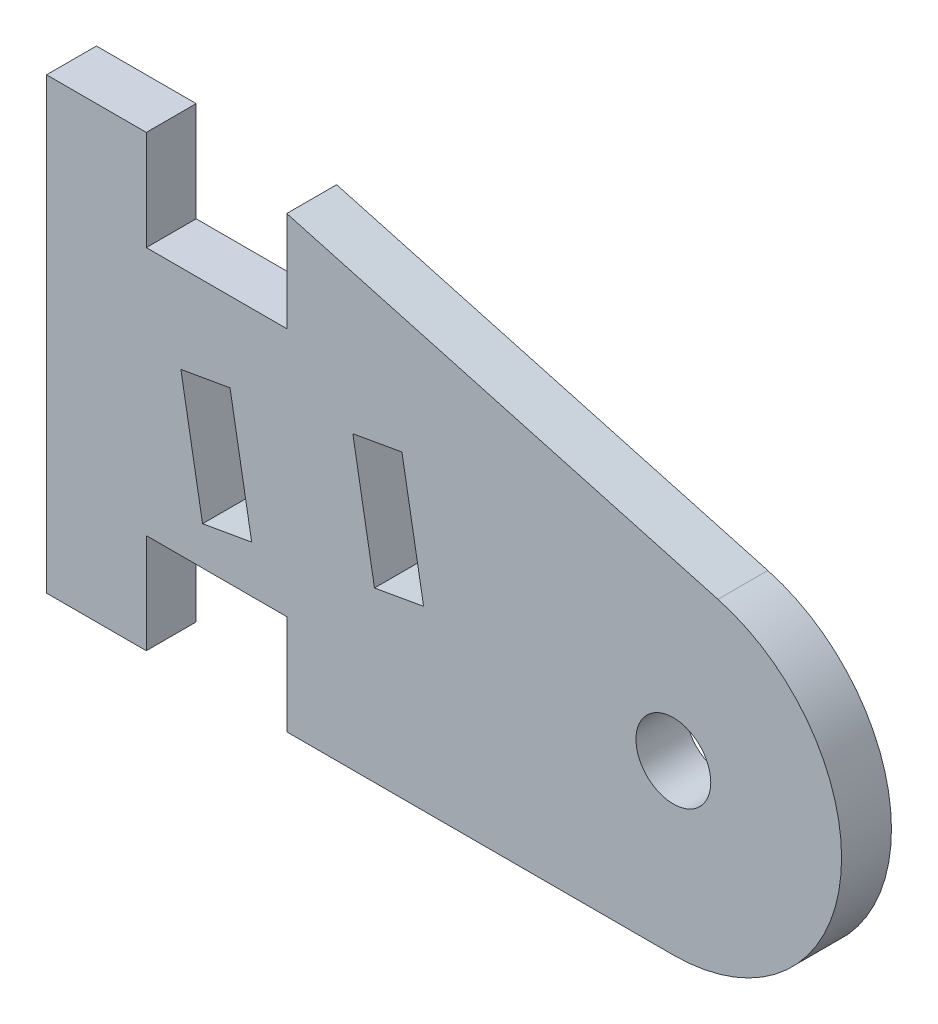
ISO-10303-21;
HEADER;
FILE_DESCRIPTION(('STEP AP214'),'2;1');
FILE_NAME('part.step','',(''),(''),'','','');
FILE_SCHEMA(('AUTOMOTIVE_DESIGN { 1 0 10303 214 1 1 1 1 }'));
ENDSEC;
DATA;
#1=APPLICATION_CONTEXT('core data for automotive mechanical design processes');
#2=APPLICATION_PROTOCOL_DEFINITION('international standard','automotive_design',2000,#1);
#3=PRODUCT_CONTEXT('',#1,'mechanical');
#4=PRODUCT('Part','Part','',(#3));
#5=PRODUCT_RELATED_PRODUCT_CATEGORY('part','',(#4));
#6=PRODUCT_DEFINITION_FORMATION('','',#4);
#7=PRODUCT_DEFINITION_CONTEXT('part definition',#1,'design');
#8=PRODUCT_DEFINITION('design','',#6,#7);
#9=PRODUCT_DEFINITION_SHAPE('','',#8);
#10=(LENGTH_UNIT() NAMED_UNIT(*) SI_UNIT(.MILLI.,.METRE.));
#11=(NAMED_UNIT(*) PLANE_ANGLE_UNIT() SI_UNIT($,.RADIAN.));
#12=(NAMED_UNIT(*) SI_UNIT($,.STERADIAN.) SOLID_ANGLE_UNIT());
#13=UNCERTAINTY_MEASURE_WITH_UNIT(LENGTH_MEASURE(1.E-05),#10,'distance_accuracy_value','');
#14=(GEOMETRIC_REPRESENTATION_CONTEXT(3) GLOBAL_UNCERTAINTY_ASSIGNED_CONTEXT((#13)) GLOBAL_UNIT_ASSIGNED_CONTEXT((#10,
#11,#12)) REPRESENTATION_CONTEXT('',''));
#15=CARTESIAN_POINT('',(0.,0.,0.));
#16=DIRECTION('',(0.,0.,1.));
#17=DIRECTION('',(1.,0.,0.));
#18=AXIS2_PLACEMENT_3D('',#15,#16,#17);
#19=CARTESIAN_POINT('',(25.1329602904938,6.74469141908519,2.));
#20=DIRECTION('',(0.,0.,1.));
#21=DIRECTION('',(1.,0.,0.));
#22=AXIS2_PLACEMENT_3D('',#19,#20,#21);
#23=PLANE('',#22);
#24=DIRECTION('',(-0.984807753012208,-0.173648177666932,0.));
#25=VECTOR('',#24,1.);
#26=CARTESIAN_POINT('',(14.2504500193325,12.02557168038,2.));
#27=LINE('',#26,#25);
#28=CARTESIAN_POINT('',(14.2504500193325,12.02557168038,2.));
#29=VERTEX_POINT('',#28);
#30=CARTESIAN_POINT('',(12.280834513308,11.6782753250461,2.));
#31=VERTEX_POINT('',#30);
#32=EDGE_CURVE('E177',#29,#31,#27,.T.);
#33=ORIENTED_EDGE('',*,*,#32,.F.);
#34=DIRECTION('',(-0.17364817766693,0.984807753012208,0.));
#35=VECTOR('',#34,1.);
#36=CARTESIAN_POINT('',(14.2504500193325,12.02557168038,2.));
#37=LINE('',#36,#35);
#38=CARTESIAN_POINT('',(15.1186909076671,7.10153291531893,2.));
#39=VERTEX_POINT('',#38);
#40=EDGE_CURVE('E169',#39,#29,#37,.T.);
#41=ORIENTED_EDGE('',*,*,#40,.F.);
#42=DIRECTION('',(0.984807753012208,0.173648177666931,0.));
#43=VECTOR('',#42,1.);
#44=CARTESIAN_POINT('',(13.1490754016427,6.75423655998507,2.));
#45=LINE('',#44,#43);
#46=CARTESIAN_POINT('',(13.1490754016427,6.75423655998507,2.));
#47=VERTEX_POINT('',#46);
#48=EDGE_CURVE('E192',#47,#39,#45,.T.);
#49=ORIENTED_EDGE('',*,*,#48,.F.);
#50=DIRECTION('',(0.173648177666931,-0.984807753012208,0.));
#51=VECTOR('',#50,1.);
#52=CARTESIAN_POINT('',(12.280834513308,11.6782753250461,2.));
#53=LINE('',#52,#51);
#54=EDGE_CURVE('E190',#31,#47,#53,.T.);
#55=ORIENTED_EDGE('',*,*,#54,.F.);
#56=EDGE_LOOP('',(#33,#41,#49,#55));
#57=FACE_BOUND('',#56,.T.);
#58=DIRECTION('',(0.,-1.,0.));
#59=VECTOR('',#58,1.);
#60=CARTESIAN_POINT('',(9.63151321176006,17.9999883596521,2.));
#61=LINE('',#60,#59);
#62=CARTESIAN_POINT('',(9.63151321176006,17.9999883596521,2.));
#63=VERTEX_POINT('',#62);
#64=CARTESIAN_POINT('',(9.63151321176006,13.9999883596521,2.));
#65=VERTEX_POINT('',#64);
#66=EDGE_CURVE('E239',#63,#65,#61,.T.);
#67=ORIENTED_EDGE('',*,*,#66,.T.);
#68=DIRECTION('',(-1.,0.,0.));
#69=VECTOR('',#68,1.);
#70=CARTESIAN_POINT('',(9.63151321176006,13.9999883596521,2.));
#71=LINE('',#70,#69);
#72=CARTESIAN_POINT('',(3.99999686234274,13.9999883596521,2.));
#73=VERTEX_POINT('',#72);
#74=EDGE_CURVE('E242',#65,#73,#71,.T.);
#75=ORIENTED_EDGE('',*,*,#74,.T.);
#76=DIRECTION('',(7.84410080292842E-07,0.999999999999692,0.));
#77=VECTOR('',#76,1.);
#78=CARTESIAN_POINT('',(3.99999999998306,17.9999883596509,2.));
#79=LINE('',#78,#77);
#80=CARTESIAN_POINT('',(3.99999999998306,17.9999883596509,2.));
#81=VERTEX_POINT('',#80);
#82=EDGE_CURVE('E245',#73,#81,#79,.T.);
#83=ORIENTED_EDGE('',*,*,#82,.T.);
#84=DIRECTION('',(-0.999999999995766,2.91008727185127E-06,0.));
#85=VECTOR('',#84,1.);
#86=CARTESIAN_POINT('',(0.,18.,2.));
#87=LINE('',#86,#85);
#88=CARTESIAN_POINT('',(0.,18.,2.));
#89=VERTEX_POINT('',#88);
#90=EDGE_CURVE('E247',#81,#89,#87,.T.);
#91=ORIENTED_EDGE('',*,*,#90,.T.);
#92=DIRECTION('',(0.,-1.,0.));
#93=VECTOR('',#92,1.);
#94=CARTESIAN_POINT('',(0.,0.,2.));
#95=LINE('',#94,#93);
#96=CARTESIAN_POINT('',(0.,0.,2.));
#97=VERTEX_POINT('',#96);
#98=EDGE_CURVE('E249',#89,#97,#95,.T.);
#99=ORIENTED_EDGE('',*,*,#98,.T.);
#100=DIRECTION('',(1.,0.,0.));
#101=VECTOR('',#100,1.);
#102=CARTESIAN_POINT('',(0.,0.,2.));
#103=LINE('',#102,#101);
#104=CARTESIAN_POINT('',(4.,0.,2.));
#105=VERTEX_POINT('',#104);
#106=EDGE_CURVE('E251',#97,#105,#103,.T.);
#107=ORIENTED_EDGE('',*,*,#106,.T.);
#108=DIRECTION('',(0.,1.,0.));
#109=VECTOR('',#108,1.);
#110=CARTESIAN_POINT('',(4.,0.,2.));
#111=LINE('',#110,#109);
#112=CARTESIAN_POINT('',(3.99999999999993,3.99964727608699,2.));
#113=VERTEX_POINT('',#112);
#114=EDGE_CURVE('E253',#105,#113,#111,.T.);
#115=ORIENTED_EDGE('',*,*,#114,.T.);
#116=DIRECTION('',(1.,0.,0.));
#117=VECTOR('',#116,1.);
#118=CARTESIAN_POINT('',(9.63146762713669,3.99964727608699,2.));
#119=LINE('',#118,#117);
#120=CARTESIAN_POINT('',(9.63146762713669,3.99964727608699,2.));
#121=VERTEX_POINT('',#120);
#122=EDGE_CURVE('E255',#113,#121,#119,.T.);
#123=ORIENTED_EDGE('',*,*,#122,.T.);
#124=DIRECTION('',(0.,-1.,0.));
#125=VECTOR('',#124,1.);
#126=CARTESIAN_POINT('',(9.63146762713669,-0.000352723912941215,2.));
#127=LINE('',#126,#125);
#128=CARTESIAN_POINT('',(9.63146762713669,-0.000352723912941215,2.));
#129=VERTEX_POINT('',#128);
#130=EDGE_CURVE('E257',#121,#129,#127,.T.);
#131=ORIENTED_EDGE('',*,*,#130,.T.);
#132=DIRECTION('',(1.,0.,0.));
#133=VECTOR('',#132,1.);
#134=CARTESIAN_POINT('',(9.63146762713669,-0.000352723912941215,2.));
#135=LINE('',#134,#133);
#136=CARTESIAN_POINT('',(25.1329602904938,-0.000352723912942082,2.));
#137=VERTEX_POINT('',#136);
#138=EDGE_CURVE('E259',#129,#137,#135,.T.);
#139=ORIENTED_EDGE('',*,*,#138,.T.);
#140=CARTESIAN_POINT('',(25.1329602904938,6.74469141908519,2.));
#141=DIRECTION('',(0.,0.,1.));
#142=DIRECTION('',(1.,0.,0.));
#143=AXIS2_PLACEMENT_3D('',#140,#141,#142);
#144=CIRCLE('',#143,6.74504414299814);
#145=CARTESIAN_POINT('',(26.9203877683975,13.2485920565664,2.));
#146=VERTEX_POINT('',#145);
#147=EDGE_CURVE('E261',#137,#146,#144,.T.);
#148=ORIENTED_EDGE('',*,*,#147,.T.);
#149=DIRECTION('',(-0.964248787642511,0.264998633071846,0.));
#150=VECTOR('',#149,1.);
#151=CARTESIAN_POINT('',(9.63151321176006,17.9999883596521,2.));
#152=LINE('',#151,#150);
#153=EDGE_CURVE('E263',#146,#63,#152,.T.);
#154=ORIENTED_EDGE('',*,*,#153,.T.);
#155=EDGE_LOOP('',(#67,#75,#83,#91,#99,#107,#115,#123,#131,#139,#148,#154));
#156=FACE_BOUND('',#155,.T.);
#157=DIRECTION('',(0.173648177666931,-0.984807753012208,0.));
#158=VECTOR('',#157,1.);
#159=CARTESIAN_POINT('',(5.38718024222247,10.4627380813776,2.));
#160=LINE('',#159,#158);
#161=CARTESIAN_POINT('',(5.38718024222247,10.4627380813776,2.));
#162=VERTEX_POINT('',#161);
#163=CARTESIAN_POINT('',(6.25542113055713,5.53869931631654,2.));
#164=VERTEX_POINT('',#163);
#165=EDGE_CURVE('E210',#162,#164,#160,.T.);
#166=ORIENTED_EDGE('',*,*,#165,.F.);
#167=DIRECTION('',(-0.984807753012208,-0.17364817766693,0.));
#168=VECTOR('',#167,1.);
#169=CARTESIAN_POINT('',(7.35679574824689,10.8100344367115,2.));
#170=LINE('',#169,#168);
#171=CARTESIAN_POINT('',(7.35679574824689,10.8100344367115,2.));
#172=VERTEX_POINT('',#171);
#173=EDGE_CURVE('E208',#172,#162,#170,.T.);
#174=ORIENTED_EDGE('',*,*,#173,.F.);
#175=DIRECTION('',(-0.17364817766693,0.984807753012208,0.));
#176=VECTOR('',#175,1.);
#177=CARTESIAN_POINT('',(7.35679574824689,10.8100344367115,2.));
#178=LINE('',#177,#176);
#179=CARTESIAN_POINT('',(8.22503663658155,5.8859956716504,2.));
#180=VERTEX_POINT('',#179);
#181=EDGE_CURVE('E216',#180,#172,#178,.T.);
#182=ORIENTED_EDGE('',*,*,#181,.F.);
#183=DIRECTION('',(0.984807753012208,0.173648177666929,0.));
#184=VECTOR('',#183,1.);
#185=CARTESIAN_POINT('',(6.25542113055713,5.53869931631654,2.));
#186=LINE('',#185,#184);
#187=EDGE_CURVE('E213',#164,#180,#186,.T.);
#188=ORIENTED_EDGE('',*,*,#187,.F.);
#189=EDGE_LOOP('',(#166,#174,#182,#188));
#190=FACE_BOUND('',#189,.T.);
#191=CARTESIAN_POINT('',(25.1329602904938,6.74469141908519,2.));
#192=DIRECTION('',(0.,0.,1.));
#193=DIRECTION('',(1.,0.,0.));
#194=AXIS2_PLACEMENT_3D('',#191,#192,#193);
#195=CIRCLE('',#194,1.49999999999872);
#196=CARTESIAN_POINT('',(26.6329602904925,6.74469141908519,2.));
#197=VERTEX_POINT('',#196);
#198=EDGE_CURVE('E198',#197,#197,#195,.T.);
#199=ORIENTED_EDGE('',*,*,#198,.F.);
#200=EDGE_LOOP('',(#199));
#201=FACE_BOUND('',#200,.T.);
#202=ADVANCED_FACE('F32',(#57,#156,#190,#201),#23,.T.);
#203=CARTESIAN_POINT('',(25.1329602904938,6.74469141908519,0.));
#204=DIRECTION('',(0.,0.,1.));
#205=DIRECTION('',(1.,0.,0.));
#206=AXIS2_PLACEMENT_3D('',#203,#204,#205);
#207=PLANE('',#206);
#208=DIRECTION('',(-0.17364817766693,0.984807753012208,0.));
#209=VECTOR('',#208,1.);
#210=CARTESIAN_POINT('',(14.2504500193325,12.02557168038,0.));
#211=LINE('',#210,#209);
#212=CARTESIAN_POINT('',(15.1186909076671,7.10153291531893,0.));
#213=VERTEX_POINT('',#212);
#214=CARTESIAN_POINT('',(14.2504500193325,12.02557168038,0.));
#215=VERTEX_POINT('',#214);
#216=EDGE_CURVE('E55',#213,#215,#211,.T.);
#217=ORIENTED_EDGE('',*,*,#216,.T.);
#218=DIRECTION('',(-0.984807753012208,-0.173648177666932,0.));
#219=VECTOR('',#218,1.);
#220=CARTESIAN_POINT('',(14.2504500193325,12.02557168038,0.));
#221=LINE('',#220,#219);
#222=CARTESIAN_POINT('',(12.280834513308,11.6782753250461,0.));
#223=VERTEX_POINT('',#222);
#224=EDGE_CURVE('E184',#215,#223,#221,.T.);
#225=ORIENTED_EDGE('',*,*,#224,.T.);
#226=DIRECTION('',(0.173648177666931,-0.984807753012208,0.));
#227=VECTOR('',#226,1.);
#228=CARTESIAN_POINT('',(12.280834513308,11.6782753250461,0.));
#229=LINE('',#228,#227);
#230=CARTESIAN_POINT('',(13.1490754016427,6.75423655998507,0.));
#231=VERTEX_POINT('',#230);
#232=EDGE_CURVE('E200',#223,#231,#229,.T.);
#233=ORIENTED_EDGE('',*,*,#232,.T.);
#234=DIRECTION('',(0.984807753012208,0.173648177666931,0.));
#235=VECTOR('',#234,1.);
#236=CARTESIAN_POINT('',(13.1490754016427,6.75423655998507,0.));
#237=LINE('',#236,#235);
#238=EDGE_CURVE('E178',#231,#213,#237,.T.);
#239=ORIENTED_EDGE('',*,*,#238,.T.);
#240=EDGE_LOOP('',(#217,#225,#233,#239));
#241=FACE_BOUND('',#240,.T.);
#242=DIRECTION('',(0.,-1.,0.));
#243=VECTOR('',#242,1.);
#244=CARTESIAN_POINT('',(9.63151321176006,17.9999883596521,0.));
#245=LINE('',#244,#243);
#246=CARTESIAN_POINT('',(9.63151321176006,17.9999883596521,0.));
#247=VERTEX_POINT('',#246);
#248=CARTESIAN_POINT('',(9.63151321176006,13.9999883596521,0.));
#249=VERTEX_POINT('',#248);
#250=EDGE_CURVE('E238',#247,#249,#245,.T.);
#251=ORIENTED_EDGE('',*,*,#250,.F.);
#252=DIRECTION('',(-0.964248787642511,0.264998633071846,0.));
#253=VECTOR('',#252,1.);
#254=CARTESIAN_POINT('',(9.63151321176006,17.9999883596521,0.));
#255=LINE('',#254,#253);
#256=CARTESIAN_POINT('',(26.9203877683975,13.2485920565664,0.));
#257=VERTEX_POINT('',#256);
#258=EDGE_CURVE('E243',#257,#247,#255,.T.);
#259=ORIENTED_EDGE('',*,*,#258,.F.);
#260=CARTESIAN_POINT('',(25.1329602904938,6.74469141908519,0.));
#261=DIRECTION('',(0.,0.,1.));
#262=DIRECTION('',(1.,0.,0.));
#263=AXIS2_PLACEMENT_3D('',#260,#261,#262);
#264=CIRCLE('',#263,6.74504414299814);
#265=CARTESIAN_POINT('',(25.1329602904938,-0.000352723912942082,0.));
#266=VERTEX_POINT('',#265);
#267=EDGE_CURVE('E286',#266,#257,#264,.T.);
#268=ORIENTED_EDGE('',*,*,#267,.F.);
#269=DIRECTION('',(1.,0.,0.));
#270=VECTOR('',#269,1.);
#271=CARTESIAN_POINT('',(9.63146762713669,-0.000352723912941215,0.));
#272=LINE('',#271,#270);
#273=CARTESIAN_POINT('',(9.63146762713669,-0.000352723912941215,0.));
#274=VERTEX_POINT('',#273);
#275=EDGE_CURVE('E284',#274,#266,#272,.T.);
#276=ORIENTED_EDGE('',*,*,#275,.F.);
#277=DIRECTION('',(0.,-1.,0.));
#278=VECTOR('',#277,1.);
#279=CARTESIAN_POINT('',(9.63146762713669,-0.000352723912941215,0.));
#280=LINE('',#279,#278);
#281=CARTESIAN_POINT('',(9.63146762713669,3.99964727608699,0.));
#282=VERTEX_POINT('',#281);
#283=EDGE_CURVE('E282',#282,#274,#280,.T.);
#284=ORIENTED_EDGE('',*,*,#283,.F.);
#285=DIRECTION('',(1.,0.,0.));
#286=VECTOR('',#285,1.);
#287=CARTESIAN_POINT('',(9.63146762713669,3.99964727608699,0.));
#288=LINE('',#287,#286);
#289=CARTESIAN_POINT('',(3.99999999999993,3.99964727608699,0.));
#290=VERTEX_POINT('',#289);
#291=EDGE_CURVE('E280',#290,#282,#288,.T.);
#292=ORIENTED_EDGE('',*,*,#291,.F.);
#293=DIRECTION('',(0.,1.,0.));
#294=VECTOR('',#293,1.);
#295=CARTESIAN_POINT('',(4.,0.,0.));
#296=LINE('',#295,#294);
#297=CARTESIAN_POINT('',(4.,0.,0.));
#298=VERTEX_POINT('',#297);
#299=EDGE_CURVE('E278',#298,#290,#296,.T.);
#300=ORIENTED_EDGE('',*,*,#299,.F.);
#301=DIRECTION('',(1.,0.,0.));
#302=VECTOR('',#301,1.);
#303=CARTESIAN_POINT('',(0.,0.,0.));
#304=LINE('',#303,#302);
#305=CARTESIAN_POINT('',(0.,0.,0.));
#306=VERTEX_POINT('',#305);
#307=EDGE_CURVE('E276',#306,#298,#304,.T.);
#308=ORIENTED_EDGE('',*,*,#307,.F.);
#309=DIRECTION('',(0.,-1.,0.));
#310=VECTOR('',#309,1.);
#311=CARTESIAN_POINT('',(0.,0.,0.));
#312=LINE('',#311,#310);
#313=CARTESIAN_POINT('',(0.,18.,0.));
#314=VERTEX_POINT('',#313);
#315=EDGE_CURVE('E274',#314,#306,#312,.T.);
#316=ORIENTED_EDGE('',*,*,#315,.F.);
#317=DIRECTION('',(-0.999999999995766,2.91008727185127E-06,0.));
#318=VECTOR('',#317,1.);
#319=CARTESIAN_POINT('',(0.,18.,0.));
#320=LINE('',#319,#318);
#321=CARTESIAN_POINT('',(3.99999999998306,17.9999883596509,0.));
#322=VERTEX_POINT('',#321);
#323=EDGE_CURVE('E272',#322,#314,#320,.T.);
#324=ORIENTED_EDGE('',*,*,#323,.F.);
#325=DIRECTION('',(7.84410080292842E-07,0.999999999999692,0.));
#326=VECTOR('',#325,1.);
#327=CARTESIAN_POINT('',(3.99999999998306,17.9999883596509,0.));
#328=LINE('',#327,#326);
#329=CARTESIAN_POINT('',(3.99999686234274,13.9999883596521,0.));
#330=VERTEX_POINT('',#329);
#331=EDGE_CURVE('E270',#330,#322,#328,.T.);
#332=ORIENTED_EDGE('',*,*,#331,.F.);
#333=DIRECTION('',(-1.,0.,0.));
#334=VECTOR('',#333,1.);
#335=CARTESIAN_POINT('',(9.63151321176006,13.9999883596521,0.));
#336=LINE('',#335,#334);
#337=EDGE_CURVE('E268',#249,#330,#336,.T.);
#338=ORIENTED_EDGE('',*,*,#337,.F.);
#339=EDGE_LOOP('',(#251,#259,#268,#276,#284,#292,#300,#308,#316,#324,#332,#338));
#340=FACE_BOUND('',#339,.T.);
#341=DIRECTION('',(-0.984807753012208,-0.17364817766693,0.));
#342=VECTOR('',#341,1.);
#343=CARTESIAN_POINT('',(7.35679574824689,10.8100344367115,0.));
#344=LINE('',#343,#342);
#345=CARTESIAN_POINT('',(7.3567957482469,10.8100344367115,0.));
#346=VERTEX_POINT('',#345);
#347=CARTESIAN_POINT('',(5.38718024222247,10.4627380813776,0.));
#348=VERTEX_POINT('',#347);
#349=EDGE_CURVE('E185',#346,#348,#344,.T.);
#350=ORIENTED_EDGE('',*,*,#349,.T.);
#351=DIRECTION('',(0.173648177666931,-0.984807753012208,0.));
#352=VECTOR('',#351,1.);
#353=CARTESIAN_POINT('',(5.38718024222247,10.4627380813776,0.));
#354=LINE('',#353,#352);
#355=CARTESIAN_POINT('',(6.25542113055713,5.53869931631654,0.));
#356=VERTEX_POINT('',#355);
#357=EDGE_CURVE('E221',#348,#356,#354,.T.);
#358=ORIENTED_EDGE('',*,*,#357,.T.);
#359=DIRECTION('',(0.984807753012208,0.173648177666929,0.));
#360=VECTOR('',#359,1.);
#361=CARTESIAN_POINT('',(6.25542113055713,5.53869931631654,0.));
#362=LINE('',#361,#360);
#363=CARTESIAN_POINT('',(8.22503663658155,5.8859956716504,0.));
#364=VERTEX_POINT('',#363);
#365=EDGE_CURVE('E224',#356,#364,#362,.T.);
#366=ORIENTED_EDGE('',*,*,#365,.T.);
#367=DIRECTION('',(-0.17364817766693,0.984807753012208,0.));
#368=VECTOR('',#367,1.);
#369=CARTESIAN_POINT('',(7.35679574824689,10.8100344367115,0.));
#370=LINE('',#369,#368);
#371=EDGE_CURVE('E211',#364,#346,#370,.T.);
#372=ORIENTED_EDGE('',*,*,#371,.T.);
#373=EDGE_LOOP('',(#350,#358,#366,#372));
#374=FACE_BOUND('',#373,.T.);
#375=CARTESIAN_POINT('',(25.1329602904938,6.74469141908519,0.));
#376=DIRECTION('',(0.,0.,1.));
#377=DIRECTION('',(1.,0.,0.));
#378=AXIS2_PLACEMENT_3D('',#375,#376,#377);
#379=CIRCLE('',#378,1.49999999999872);
#380=CARTESIAN_POINT('',(26.6329602904925,6.74469141908519,0.));
#381=VERTEX_POINT('',#380);
#382=EDGE_CURVE('E580',#381,#381,#379,.T.);
#383=ORIENTED_EDGE('',*,*,#382,.T.);
#384=EDGE_LOOP('',(#383));
#385=FACE_BOUND('',#384,.T.);
#386=ADVANCED_FACE('F328',(#241,#340,#374,#385),#207,.F.);
#387=CARTESIAN_POINT('',(9.63151321176006,17.9999883596521,2.));
#388=DIRECTION('',(1.,0.,0.));
#389=DIRECTION('',(0.,1.,0.));
#390=AXIS2_PLACEMENT_3D('',#387,#388,#389);
#391=PLANE('',#390);
#392=ORIENTED_EDGE('',*,*,#250,.T.);
#393=DIRECTION('',(0.,0.,-1.));
#394=VECTOR('',#393,1.);
#395=CARTESIAN_POINT('',(9.63151321176006,13.9999883596521,2.));
#396=LINE('',#395,#394);
#397=EDGE_CURVE('E11',#65,#249,#396,.T.);
#398=ORIENTED_EDGE('',*,*,#397,.F.);
#399=ORIENTED_EDGE('',*,*,#66,.F.);
#400=DIRECTION('',(0.,0.,-1.));
#401=VECTOR('',#400,1.);
#402=CARTESIAN_POINT('',(9.63151321176006,17.9999883596521,2.));
#403=LINE('',#402,#401);
#404=EDGE_CURVE('E265',#63,#247,#403,.T.);
#405=ORIENTED_EDGE('',*,*,#404,.T.);
#406=EDGE_LOOP('',(#392,#398,#399,#405));
#407=FACE_BOUND('',#406,.T.);
#408=ADVANCED_FACE('F34',(#407),#391,.F.);
#409=CARTESIAN_POINT('',(9.63151321176006,13.9999883596521,2.));
#410=DIRECTION('',(0.,-1.,0.));
#411=DIRECTION('',(0.,0.,-1.));
#412=AXIS2_PLACEMENT_3D('',#409,#410,#411);
#413=PLANE('',#412);
#414=ORIENTED_EDGE('',*,*,#337,.T.);
#415=DIRECTION('',(0.,0.,-1.));
#416=VECTOR('',#415,1.);
#417=CARTESIAN_POINT('',(3.99999686234274,13.9999883596521,2.));
#418=LINE('',#417,#416);
#419=EDGE_CURVE('E40',#73,#330,#418,.T.);
#420=ORIENTED_EDGE('',*,*,#419,.F.);
#421=ORIENTED_EDGE('',*,*,#74,.F.);
#422=ORIENTED_EDGE('',*,*,#397,.T.);
#423=EDGE_LOOP('',(#414,#420,#421,#422));
#424=FACE_BOUND('',#423,.T.);
#425=ADVANCED_FACE('F345',(#424),#413,.F.);
#426=CARTESIAN_POINT('',(3.99999999998306,17.9999883596509,2.));
#427=DIRECTION('',(-0.999999999999692,7.84410080292842E-07,0.));
#428=DIRECTION('',(-7.84410080292842E-07,-0.999999999999692,0.));
#429=AXIS2_PLACEMENT_3D('',#426,#427,#428);
#430=PLANE('',#429);
#431=ORIENTED_EDGE('',*,*,#331,.T.);
#432=DIRECTION('',(0.,0.,-1.));
#433=VECTOR('',#432,1.);
#434=CARTESIAN_POINT('',(3.99999999998306,17.9999883596509,2.));
#435=LINE('',#434,#433);
#436=EDGE_CURVE('E315',#81,#322,#435,.T.);
#437=ORIENTED_EDGE('',*,*,#436,.F.);
#438=ORIENTED_EDGE('',*,*,#82,.F.);
#439=ORIENTED_EDGE('',*,*,#419,.T.);
#440=EDGE_LOOP('',(#431,#437,#438,#439));
#441=FACE_BOUND('',#440,.T.);
#442=ADVANCED_FACE('F322',(#441),#430,.F.);
#443=CARTESIAN_POINT('',(0.,18.,2.));
#444=DIRECTION('',(-2.91008727185127E-06,-0.999999999995766,0.));
#445=DIRECTION('',(0.999999999995766,-2.91008727185127E-06,0.));
#446=AXIS2_PLACEMENT_3D('',#443,#444,#445);
#447=PLANE('',#446);
#448=ORIENTED_EDGE('',*,*,#323,.T.);
#449=DIRECTION('',(0.,0.,-1.));
#450=VECTOR('',#449,1.);
#451=CARTESIAN_POINT('',(0.,18.,2.));
#452=LINE('',#451,#450);
#453=EDGE_CURVE('E312',#89,#314,#452,.T.);
#454=ORIENTED_EDGE('',*,*,#453,.F.);
#455=ORIENTED_EDGE('',*,*,#90,.F.);
#456=ORIENTED_EDGE('',*,*,#436,.T.);
#457=EDGE_LOOP('',(#448,#454,#455,#456));
#458=FACE_BOUND('',#457,.T.);
#459=ADVANCED_FACE('F334',(#458),#447,.F.);
#460=CARTESIAN_POINT('',(0.,0.,2.));
#461=DIRECTION('',(1.,0.,0.));
#462=DIRECTION('',(0.,0.,-1.));
#463=AXIS2_PLACEMENT_3D('',#460,#461,#462);
#464=PLANE('',#463);
#465=ORIENTED_EDGE('',*,*,#315,.T.);
#466=DIRECTION('',(0.,0.,-1.));
#467=VECTOR('',#466,1.);
#468=CARTESIAN_POINT('',(0.,0.,2.));
#469=LINE('',#468,#467);
#470=EDGE_CURVE('E309',#97,#306,#469,.T.);
#471=ORIENTED_EDGE('',*,*,#470,.F.);
#472=ORIENTED_EDGE('',*,*,#98,.F.);
#473=ORIENTED_EDGE('',*,*,#453,.T.);
#474=EDGE_LOOP('',(#465,#471,#472,#473));
#475=FACE_BOUND('',#474,.T.);
#476=ADVANCED_FACE('F338',(#475),#464,.F.);
#477=CARTESIAN_POINT('',(0.,0.,2.));
#478=DIRECTION('',(0.,1.,0.));
#479=DIRECTION('',(0.,0.,1.));
#480=AXIS2_PLACEMENT_3D('',#477,#478,#479);
#481=PLANE('',#480);
#482=ORIENTED_EDGE('',*,*,#307,.T.);
#483=DIRECTION('',(0.,0.,-1.));
#484=VECTOR('',#483,1.);
#485=CARTESIAN_POINT('',(4.,0.,2.));
#486=LINE('',#485,#484);
#487=EDGE_CURVE('E306',#105,#298,#486,.T.);
#488=ORIENTED_EDGE('',*,*,#487,.F.);
#489=ORIENTED_EDGE('',*,*,#106,.F.);
#490=ORIENTED_EDGE('',*,*,#470,.T.);
#491=EDGE_LOOP('',(#482,#488,#489,#490));
#492=FACE_BOUND('',#491,.T.);
#493=ADVANCED_FACE('F378',(#492),#481,.F.);
#494=CARTESIAN_POINT('',(4.,0.,2.));
#495=DIRECTION('',(-1.,0.,0.));
#496=DIRECTION('',(0.,-1.,0.));
#497=AXIS2_PLACEMENT_3D('',#494,#495,#496);
#498=PLANE('',#497);
#499=ORIENTED_EDGE('',*,*,#299,.T.);
#500=DIRECTION('',(0.,0.,-1.));
#501=VECTOR('',#500,1.);
#502=CARTESIAN_POINT('',(3.99999999999993,3.99964727608699,2.));
#503=LINE('',#502,#501);
#504=EDGE_CURVE('E303',#113,#290,#503,.T.);
#505=ORIENTED_EDGE('',*,*,#504,.F.);
#506=ORIENTED_EDGE('',*,*,#114,.F.);
#507=ORIENTED_EDGE('',*,*,#487,.T.);
#508=EDGE_LOOP('',(#499,#505,#506,#507));
#509=FACE_BOUND('',#508,.T.);
#510=ADVANCED_FACE('F376',(#509),#498,.F.);
#511=CARTESIAN_POINT('',(9.63146762713669,3.99964727608699,2.));
#512=DIRECTION('',(0.,1.,0.));
#513=DIRECTION('',(0.,0.,1.));
#514=AXIS2_PLACEMENT_3D('',#511,#512,#513);
#515=PLANE('',#514);
#516=ORIENTED_EDGE('',*,*,#291,.T.);
#517=DIRECTION('',(0.,0.,-1.));
#518=VECTOR('',#517,1.);
#519=CARTESIAN_POINT('',(9.63146762713669,3.99964727608699,2.));
#520=LINE('',#519,#518);
#521=EDGE_CURVE('E300',#121,#282,#520,.T.);
#522=ORIENTED_EDGE('',*,*,#521,.F.);
#523=ORIENTED_EDGE('',*,*,#122,.F.);
#524=ORIENTED_EDGE('',*,*,#504,.T.);
#525=EDGE_LOOP('',(#516,#522,#523,#524));
#526=FACE_BOUND('',#525,.T.);
#527=ADVANCED_FACE('F372',(#526),#515,.F.);
#528=CARTESIAN_POINT('',(9.63146762713669,-0.000352723912941215,2.));
#529=DIRECTION('',(1.,0.,0.));
#530=DIRECTION('',(0.,1.,0.));
#531=AXIS2_PLACEMENT_3D('',#528,#529,#530);
#532=PLANE('',#531);
#533=ORIENTED_EDGE('',*,*,#283,.T.);
#534=DIRECTION('',(0.,0.,-1.));
#535=VECTOR('',#534,1.);
#536=CARTESIAN_POINT('',(9.63146762713669,-0.000352723912941215,2.));
#537=LINE('',#536,#535);
#538=EDGE_CURVE('E297',#129,#274,#537,.T.);
#539=ORIENTED_EDGE('',*,*,#538,.F.);
#540=ORIENTED_EDGE('',*,*,#130,.F.);
#541=ORIENTED_EDGE('',*,*,#521,.T.);
#542=EDGE_LOOP('',(#533,#539,#540,#541));
#543=FACE_BOUND('',#542,.T.);
#544=ADVANCED_FACE('F367',(#543),#532,.F.);
#545=CARTESIAN_POINT('',(9.63146762713669,-0.000352723912941215,2.));
#546=DIRECTION('',(0.,1.,0.));
#547=DIRECTION('',(0.,0.,1.));
#548=AXIS2_PLACEMENT_3D('',#545,#546,#547);
#549=PLANE('',#548);
#550=ORIENTED_EDGE('',*,*,#275,.T.);
#551=DIRECTION('',(0.,0.,-1.));
#552=VECTOR('',#551,1.);
#553=CARTESIAN_POINT('',(25.1329602904938,-0.000352723912942082,2.));
#554=LINE('',#553,#552);
#555=EDGE_CURVE('E294',#137,#266,#554,.T.);
#556=ORIENTED_EDGE('',*,*,#555,.F.);
#557=ORIENTED_EDGE('',*,*,#138,.F.);
#558=ORIENTED_EDGE('',*,*,#538,.T.);
#559=EDGE_LOOP('',(#550,#556,#557,#558));
#560=FACE_BOUND('',#559,.T.);
#561=ADVANCED_FACE('F361',(#560),#549,.F.);
#562=CARTESIAN_POINT('',(25.1329602904938,6.74469141908519,2.));
#563=DIRECTION('',(0.,0.,-1.));
#564=DIRECTION('',(-1.,0.,0.));
#565=AXIS2_PLACEMENT_3D('',#562,#563,#564);
#566=CYLINDRICAL_SURFACE('',#565,6.74504414299814);
#567=ORIENTED_EDGE('',*,*,#267,.T.);
#568=DIRECTION('',(0.,0.,-1.));
#569=VECTOR('',#568,1.);
#570=CARTESIAN_POINT('',(26.9203877683975,13.2485920565664,2.));
#571=LINE('',#570,#569);
#572=EDGE_CURVE('E291',#146,#257,#571,.T.);
#573=ORIENTED_EDGE('',*,*,#572,.F.);
#574=ORIENTED_EDGE('',*,*,#147,.F.);
#575=ORIENTED_EDGE('',*,*,#555,.T.);
#576=EDGE_LOOP('',(#567,#573,#574,#575));
#577=FACE_BOUND('',#576,.T.);
#578=ADVANCED_FACE('F357',(#577),#566,.T.);
#579=CARTESIAN_POINT('',(9.63151321176006,17.9999883596521,2.));
#580=DIRECTION('',(-0.264998633071846,-0.964248787642511,0.));
#581=DIRECTION('',(0.964248787642511,-0.264998633071846,0.));
#582=AXIS2_PLACEMENT_3D('',#579,#580,#581);
#583=PLANE('',#582);
#584=ORIENTED_EDGE('',*,*,#258,.T.);
#585=ORIENTED_EDGE('',*,*,#404,.F.);
#586=ORIENTED_EDGE('',*,*,#153,.F.);
#587=ORIENTED_EDGE('',*,*,#572,.T.);
#588=EDGE_LOOP('',(#584,#585,#586,#587));
#589=FACE_BOUND('',#588,.T.);
#590=ADVANCED_FACE('F352',(#589),#583,.F.);
#591=CARTESIAN_POINT('',(7.35679574824689,10.8100344367115,2.));
#592=DIRECTION('',(0.17364817766693,-0.984807753012208,0.));
#593=DIRECTION('',(0.984807753012208,0.17364817766693,0.));
#594=AXIS2_PLACEMENT_3D('',#591,#592,#593);
#595=PLANE('',#594);
#596=ORIENTED_EDGE('',*,*,#349,.F.);
#597=DIRECTION('',(0.,0.,-1.));
#598=VECTOR('',#597,1.);
#599=CARTESIAN_POINT('',(7.35679574824689,10.8100344367115,2.));
#600=LINE('',#599,#598);
#601=EDGE_CURVE('E218',#172,#346,#600,.T.);
#602=ORIENTED_EDGE('',*,*,#601,.F.);
#603=ORIENTED_EDGE('',*,*,#173,.T.);
#604=DIRECTION('',(0.,0.,-1.));
#605=VECTOR('',#604,1.);
#606=CARTESIAN_POINT('',(5.38718024222247,10.4627380813776,2.));
#607=LINE('',#606,#605);
#608=EDGE_CURVE('E235',#162,#348,#607,.T.);
#609=ORIENTED_EDGE('',*,*,#608,.T.);
#610=EDGE_LOOP('',(#596,#602,#603,#609));
#611=FACE_BOUND('',#610,.T.);
#612=ADVANCED_FACE('F395',(#611),#595,.T.);
#613=CARTESIAN_POINT('',(5.38718024222247,10.4627380813776,2.));
#614=DIRECTION('',(0.984807753012208,0.173648177666931,0.));
#615=DIRECTION('',(-0.173648177666931,0.984807753012208,0.));
#616=AXIS2_PLACEMENT_3D('',#613,#614,#615);
#617=PLANE('',#616);
#618=ORIENTED_EDGE('',*,*,#357,.F.);
#619=ORIENTED_EDGE('',*,*,#608,.F.);
#620=ORIENTED_EDGE('',*,*,#165,.T.);
#621=DIRECTION('',(0.,0.,-1.));
#622=VECTOR('',#621,1.);
#623=CARTESIAN_POINT('',(6.25542113055713,5.53869931631654,2.));
#624=LINE('',#623,#622);
#625=EDGE_CURVE('E233',#164,#356,#624,.T.);
#626=ORIENTED_EDGE('',*,*,#625,.T.);
#627=EDGE_LOOP('',(#618,#619,#620,#626));
#628=FACE_BOUND('',#627,.T.);
#629=ADVANCED_FACE('F433',(#628),#617,.T.);
#630=CARTESIAN_POINT('',(6.25542113055713,5.53869931631654,2.));
#631=DIRECTION('',(-0.173648177666929,0.984807753012208,0.));
#632=DIRECTION('',(-0.984807753012208,-0.173648177666929,0.));
#633=AXIS2_PLACEMENT_3D('',#630,#631,#632);
#634=PLANE('',#633);
#635=ORIENTED_EDGE('',*,*,#365,.F.);
#636=ORIENTED_EDGE('',*,*,#625,.F.);
#637=ORIENTED_EDGE('',*,*,#187,.T.);
#638=DIRECTION('',(0.,0.,-1.));
#639=VECTOR('',#638,1.);
#640=CARTESIAN_POINT('',(8.22503663658155,5.8859956716504,2.));
#641=LINE('',#640,#639);
#642=EDGE_CURVE('E231',#180,#364,#641,.T.);
#643=ORIENTED_EDGE('',*,*,#642,.T.);
#644=EDGE_LOOP('',(#635,#636,#637,#643));
#645=FACE_BOUND('',#644,.T.);
#646=ADVANCED_FACE('F440',(#645),#634,.T.);
#647=CARTESIAN_POINT('',(7.35679574824689,10.8100344367115,2.));
#648=DIRECTION('',(-0.984807753012208,-0.17364817766693,0.));
#649=DIRECTION('',(0.17364817766693,-0.984807753012208,0.));
#650=AXIS2_PLACEMENT_3D('',#647,#648,#649);
#651=PLANE('',#650);
#652=ORIENTED_EDGE('',*,*,#371,.F.);
#653=ORIENTED_EDGE('',*,*,#642,.F.);
#654=ORIENTED_EDGE('',*,*,#181,.T.);
#655=ORIENTED_EDGE('',*,*,#601,.T.);
#656=EDGE_LOOP('',(#652,#653,#654,#655));
#657=FACE_BOUND('',#656,.T.);
#658=ADVANCED_FACE('F447',(#657),#651,.T.);
#659=CARTESIAN_POINT('',(14.2504500193325,12.02557168038,2.));
#660=DIRECTION('',(-0.984807753012208,-0.17364817766693,0.));
#661=DIRECTION('',(0.17364817766693,-0.984807753012208,0.));
#662=AXIS2_PLACEMENT_3D('',#659,#660,#661);
#663=PLANE('',#662);
#664=ORIENTED_EDGE('',*,*,#216,.F.);
#665=DIRECTION('',(0.,0.,-1.));
#666=VECTOR('',#665,1.);
#667=CARTESIAN_POINT('',(15.1186909076671,7.10153291531893,2.));
#668=LINE('',#667,#666);
#669=EDGE_CURVE('E173',#39,#213,#668,.T.);
#670=ORIENTED_EDGE('',*,*,#669,.F.);
#671=ORIENTED_EDGE('',*,*,#40,.T.);
#672=DIRECTION('',(0.,0.,-1.));
#673=VECTOR('',#672,1.);
#674=CARTESIAN_POINT('',(14.2504500193325,12.02557168038,2.));
#675=LINE('',#674,#673);
#676=EDGE_CURVE('E172',#29,#215,#675,.T.);
#677=ORIENTED_EDGE('',*,*,#676,.T.);
#678=EDGE_LOOP('',(#664,#670,#671,#677));
#679=FACE_BOUND('',#678,.T.);
#680=ADVANCED_FACE('F171',(#679),#663,.T.);
#681=CARTESIAN_POINT('',(14.2504500193325,12.02557168038,2.));
#682=DIRECTION('',(0.173648177666932,-0.984807753012208,0.));
#683=DIRECTION('',(0.984807753012208,0.173648177666932,0.));
#684=AXIS2_PLACEMENT_3D('',#681,#682,#683);
#685=PLANE('',#684);
#686=ORIENTED_EDGE('',*,*,#224,.F.);
#687=ORIENTED_EDGE('',*,*,#676,.F.);
#688=ORIENTED_EDGE('',*,*,#32,.T.);
#689=DIRECTION('',(0.,0.,-1.));
#690=VECTOR('',#689,1.);
#691=CARTESIAN_POINT('',(12.280834513308,11.6782753250461,2.));
#692=LINE('',#691,#690);
#693=EDGE_CURVE('E186',#31,#223,#692,.T.);
#694=ORIENTED_EDGE('',*,*,#693,.T.);
#695=EDGE_LOOP('',(#686,#687,#688,#694));
#696=FACE_BOUND('',#695,.T.);
#697=ADVANCED_FACE('F181',(#696),#685,.T.);
#698=CARTESIAN_POINT('',(12.280834513308,11.6782753250461,2.));
#699=DIRECTION('',(0.984807753012208,0.173648177666931,0.));
#700=DIRECTION('',(-0.173648177666931,0.984807753012208,0.));
#701=AXIS2_PLACEMENT_3D('',#698,#699,#700);
#702=PLANE('',#701);
#703=ORIENTED_EDGE('',*,*,#232,.F.);
#704=ORIENTED_EDGE('',*,*,#693,.F.);
#705=ORIENTED_EDGE('',*,*,#54,.T.);
#706=DIRECTION('',(0.,0.,-1.));
#707=VECTOR('',#706,1.);
#708=CARTESIAN_POINT('',(13.1490754016427,6.75423655998507,2.));
#709=LINE('',#708,#707);
#710=EDGE_CURVE('E47',#47,#231,#709,.T.);
#711=ORIENTED_EDGE('',*,*,#710,.T.);
#712=EDGE_LOOP('',(#703,#704,#705,#711));
#713=FACE_BOUND('',#712,.T.);
#714=ADVANCED_FACE('F468',(#713),#702,.T.);
#715=CARTESIAN_POINT('',(13.1490754016427,6.75423655998507,2.));
#716=DIRECTION('',(-0.173648177666931,0.984807753012208,0.));
#717=DIRECTION('',(-0.984807753012208,-0.173648177666931,0.));
#718=AXIS2_PLACEMENT_3D('',#715,#716,#717);
#719=PLANE('',#718);
#720=ORIENTED_EDGE('',*,*,#238,.F.);
#721=ORIENTED_EDGE('',*,*,#710,.F.);
#722=ORIENTED_EDGE('',*,*,#48,.T.);
#723=ORIENTED_EDGE('',*,*,#669,.T.);
#724=EDGE_LOOP('',(#720,#721,#722,#723));
#725=FACE_BOUND('',#724,.T.);
#726=ADVANCED_FACE('F475',(#725),#719,.T.);
#727=CARTESIAN_POINT('',(25.1329602904938,6.74469141908519,2.));
#728=DIRECTION('',(0.,0.,-1.));
#729=DIRECTION('',(-1.,0.,0.));
#730=AXIS2_PLACEMENT_3D('',#727,#728,#729);
#731=CYLINDRICAL_SURFACE('',#730,1.49999999999872);
#732=ORIENTED_EDGE('',*,*,#198,.T.);
#733=EDGE_LOOP('',(#732));
#734=FACE_BOUND('',#733,.T.);
#735=ORIENTED_EDGE('',*,*,#382,.F.);
#736=EDGE_LOOP('',(#735));
#737=FACE_BOUND('',#736,.T.);
#738=ADVANCED_FACE('F483',(#734,#737),#731,.F.);
#739=CLOSED_SHELL('',(#202,#386,#408,#425,#442,#459,#476,#493,#510,#527,#544,#561,#578,#590,
#612,#629,#646,#658,#680,#697,#714,#726,#738));
#740=MANIFOLD_SOLID_BREP('B2',#739);
#741=ADVANCED_BREP_SHAPE_REPRESENTATION('',(#18,#740),#14);
#742=SHAPE_DEFINITION_REPRESENTATION(#9,#741);
ENDSEC;
END-ISO-10303-21;
